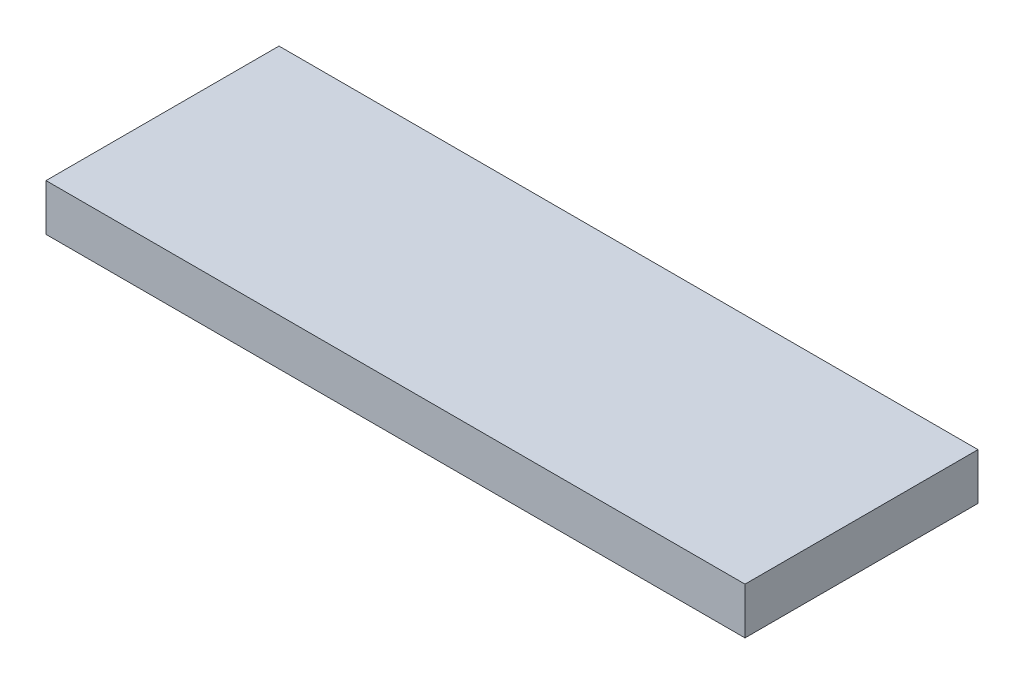
ISO-10303-21;
HEADER;
FILE_DESCRIPTION(('STEP AP214'),'2;1');
FILE_NAME('part.step','',(''),(''),'','','');
FILE_SCHEMA(('AUTOMOTIVE_DESIGN { 1 0 10303 214 1 1 1 1 }'));
ENDSEC;
DATA;
#1=APPLICATION_CONTEXT('core data for automotive mechanical design processes');
#2=APPLICATION_PROTOCOL_DEFINITION('international standard','automotive_design',2000,#1);
#3=PRODUCT_CONTEXT('',#1,'mechanical');
#4=PRODUCT('Part','Part','',(#3));
#5=PRODUCT_RELATED_PRODUCT_CATEGORY('part','',(#4));
#6=PRODUCT_DEFINITION_FORMATION('','',#4);
#7=PRODUCT_DEFINITION_CONTEXT('part definition',#1,'design');
#8=PRODUCT_DEFINITION('design','',#6,#7);
#9=PRODUCT_DEFINITION_SHAPE('','',#8);
#10=(LENGTH_UNIT() NAMED_UNIT(*) SI_UNIT(.MILLI.,.METRE.));
#11=(NAMED_UNIT(*) PLANE_ANGLE_UNIT() SI_UNIT($,.RADIAN.));
#12=(NAMED_UNIT(*) SI_UNIT($,.STERADIAN.) SOLID_ANGLE_UNIT());
#13=UNCERTAINTY_MEASURE_WITH_UNIT(LENGTH_MEASURE(1.E-05),#10,'distance_accuracy_value','');
#14=(GEOMETRIC_REPRESENTATION_CONTEXT(3) GLOBAL_UNCERTAINTY_ASSIGNED_CONTEXT((#13)) GLOBAL_UNIT_ASSIGNED_CONTEXT((#10,
#11,#12)) REPRESENTATION_CONTEXT('',''));
#15=CARTESIAN_POINT('',(0.,0.,0.));
#16=DIRECTION('',(0.,0.,1.));
#17=DIRECTION('',(1.,0.,0.));
#18=AXIS2_PLACEMENT_3D('',#15,#16,#17);
#19=CARTESIAN_POINT('',(0.,2.54,0.));
#20=DIRECTION('',(0.,0.,-1.));
#21=DIRECTION('',(-1.,0.,0.));
#22=AXIS2_PLACEMENT_3D('',#19,#20,#21);
#23=PLANE('',#22);
#24=DIRECTION('',(1.,0.,0.));
#25=VECTOR('',#24,1.);
#26=CARTESIAN_POINT('',(0.,0.,0.));
#27=LINE('',#26,#25);
#28=CARTESIAN_POINT('',(0.,0.,0.));
#29=VERTEX_POINT('',#28);
#30=CARTESIAN_POINT('',(38.1,0.,0.));
#31=VERTEX_POINT('',#30);
#32=EDGE_CURVE('E95',#29,#31,#27,.T.);
#33=ORIENTED_EDGE('',*,*,#32,.T.);
#34=DIRECTION('',(0.,-1.,0.));
#35=VECTOR('',#34,1.);
#36=CARTESIAN_POINT('',(38.1,2.54,0.));
#37=LINE('',#36,#35);
#38=CARTESIAN_POINT('',(38.1,2.54,0.));
#39=VERTEX_POINT('',#38);
#40=EDGE_CURVE('E11',#39,#31,#37,.T.);
#41=ORIENTED_EDGE('',*,*,#40,.F.);
#42=DIRECTION('',(1.,0.,0.));
#43=VECTOR('',#42,1.);
#44=CARTESIAN_POINT('',(0.,2.54,0.));
#45=LINE('',#44,#43);
#46=CARTESIAN_POINT('',(0.,2.54,0.));
#47=VERTEX_POINT('',#46);
#48=EDGE_CURVE('E81',#47,#39,#45,.T.);
#49=ORIENTED_EDGE('',*,*,#48,.F.);
#50=DIRECTION('',(0.,-1.,0.));
#51=VECTOR('',#50,1.);
#52=CARTESIAN_POINT('',(0.,2.54,0.));
#53=LINE('',#52,#51);
#54=EDGE_CURVE('E48',#47,#29,#53,.T.);
#55=ORIENTED_EDGE('',*,*,#54,.T.);
#56=EDGE_LOOP('',(#33,#41,#49,#55));
#57=FACE_BOUND('',#56,.T.);
#58=ADVANCED_FACE('F32',(#57),#23,.F.);
#59=CARTESIAN_POINT('',(38.1,2.54,0.));
#60=DIRECTION('',(-1.,0.,0.));
#61=DIRECTION('',(0.,0.,1.));
#62=AXIS2_PLACEMENT_3D('',#59,#60,#61);
#63=PLANE('',#62);
#64=DIRECTION('',(0.,0.,-1.));
#65=VECTOR('',#64,1.);
#66=CARTESIAN_POINT('',(38.1,0.,0.));
#67=LINE('',#66,#65);
#68=CARTESIAN_POINT('',(38.1,0.,-12.7));
#69=VERTEX_POINT('',#68);
#70=EDGE_CURVE('E86',#31,#69,#67,.T.);
#71=ORIENTED_EDGE('',*,*,#70,.T.);
#72=DIRECTION('',(0.,-1.,0.));
#73=VECTOR('',#72,1.);
#74=CARTESIAN_POINT('',(38.1,2.54,-12.7));
#75=LINE('',#74,#73);
#76=CARTESIAN_POINT('',(38.1,2.54,-12.7));
#77=VERTEX_POINT('',#76);
#78=EDGE_CURVE('E40',#77,#69,#75,.T.);
#79=ORIENTED_EDGE('',*,*,#78,.F.);
#80=DIRECTION('',(0.,0.,-1.));
#81=VECTOR('',#80,1.);
#82=CARTESIAN_POINT('',(38.1,2.54,0.));
#83=LINE('',#82,#81);
#84=EDGE_CURVE('E73',#39,#77,#83,.T.);
#85=ORIENTED_EDGE('',*,*,#84,.F.);
#86=ORIENTED_EDGE('',*,*,#40,.T.);
#87=EDGE_LOOP('',(#71,#79,#85,#86));
#88=FACE_BOUND('',#87,.T.);
#89=ADVANCED_FACE('F85',(#88),#63,.F.);
#90=CARTESIAN_POINT('',(0.,2.54,-12.7));
#91=DIRECTION('',(0.,0.,-1.));
#92=DIRECTION('',(-1.,0.,0.));
#93=AXIS2_PLACEMENT_3D('',#90,#91,#92);
#94=PLANE('',#93);
#95=DIRECTION('',(1.,0.,0.));
#96=VECTOR('',#95,1.);
#97=CARTESIAN_POINT('',(0.,0.,-12.7));
#98=LINE('',#97,#96);
#99=CARTESIAN_POINT('',(0.,0.,-12.7));
#100=VERTEX_POINT('',#99);
#101=EDGE_CURVE('E98',#100,#69,#98,.T.);
#102=ORIENTED_EDGE('',*,*,#101,.F.);
#103=DIRECTION('',(0.,-1.,0.));
#104=VECTOR('',#103,1.);
#105=CARTESIAN_POINT('',(0.,2.54,-12.7));
#106=LINE('',#105,#104);
#107=CARTESIAN_POINT('',(0.,2.54,-12.7));
#108=VERTEX_POINT('',#107);
#109=EDGE_CURVE('E62',#108,#100,#106,.T.);
#110=ORIENTED_EDGE('',*,*,#109,.F.);
#111=DIRECTION('',(1.,0.,0.));
#112=VECTOR('',#111,1.);
#113=CARTESIAN_POINT('',(0.,2.54,-12.7));
#114=LINE('',#113,#112);
#115=EDGE_CURVE('E80',#108,#77,#114,.T.);
#116=ORIENTED_EDGE('',*,*,#115,.T.);
#117=ORIENTED_EDGE('',*,*,#78,.T.);
#118=EDGE_LOOP('',(#102,#110,#116,#117));
#119=FACE_BOUND('',#118,.T.);
#120=ADVANCED_FACE('F89',(#119),#94,.T.);
#121=CARTESIAN_POINT('',(0.,2.54,0.));
#122=DIRECTION('',(-1.,0.,0.));
#123=DIRECTION('',(0.,0.,1.));
#124=AXIS2_PLACEMENT_3D('',#121,#122,#123);
#125=PLANE('',#124);
#126=DIRECTION('',(0.,0.,-1.));
#127=VECTOR('',#126,1.);
#128=CARTESIAN_POINT('',(0.,0.,0.));
#129=LINE('',#128,#127);
#130=EDGE_CURVE('E100',#29,#100,#129,.T.);
#131=ORIENTED_EDGE('',*,*,#130,.F.);
#132=ORIENTED_EDGE('',*,*,#54,.F.);
#133=DIRECTION('',(0.,0.,-1.));
#134=VECTOR('',#133,1.);
#135=CARTESIAN_POINT('',(0.,2.54,0.));
#136=LINE('',#135,#134);
#137=EDGE_CURVE('E90',#47,#108,#136,.T.);
#138=ORIENTED_EDGE('',*,*,#137,.T.);
#139=ORIENTED_EDGE('',*,*,#109,.T.);
#140=EDGE_LOOP('',(#131,#132,#138,#139));
#141=FACE_BOUND('',#140,.T.);
#142=ADVANCED_FACE('F106',(#141),#125,.T.);
#143=CARTESIAN_POINT('',(0.,2.54,0.));
#144=DIRECTION('',(0.,1.,0.));
#145=DIRECTION('',(0.,0.,1.));
#146=AXIS2_PLACEMENT_3D('',#143,#144,#145);
#147=PLANE('',#146);
#148=ORIENTED_EDGE('',*,*,#48,.T.);
#149=ORIENTED_EDGE('',*,*,#84,.T.);
#150=ORIENTED_EDGE('',*,*,#115,.F.);
#151=ORIENTED_EDGE('',*,*,#137,.F.);
#152=EDGE_LOOP('',(#148,#149,#150,#151));
#153=FACE_BOUND('',#152,.T.);
#154=ADVANCED_FACE('F77',(#153),#147,.T.);
#155=CARTESIAN_POINT('',(0.,0.,0.));
#156=DIRECTION('',(0.,1.,0.));
#157=DIRECTION('',(0.,0.,1.));
#158=AXIS2_PLACEMENT_3D('',#155,#156,#157);
#159=PLANE('',#158);
#160=ORIENTED_EDGE('',*,*,#32,.F.);
#161=ORIENTED_EDGE('',*,*,#130,.T.);
#162=ORIENTED_EDGE('',*,*,#101,.T.);
#163=ORIENTED_EDGE('',*,*,#70,.F.);
#164=EDGE_LOOP('',(#160,#161,#162,#163));
#165=FACE_BOUND('',#164,.T.);
#166=ADVANCED_FACE('F105',(#165),#159,.F.);
#167=CLOSED_SHELL('',(#58,#89,#120,#142,#154,#166));
#168=MANIFOLD_SOLID_BREP('B2',#167);
#169=ADVANCED_BREP_SHAPE_REPRESENTATION('',(#18,#168),#14);
#170=SHAPE_DEFINITION_REPRESENTATION(#9,#169);
ENDSEC;
END-ISO-10303-21;
